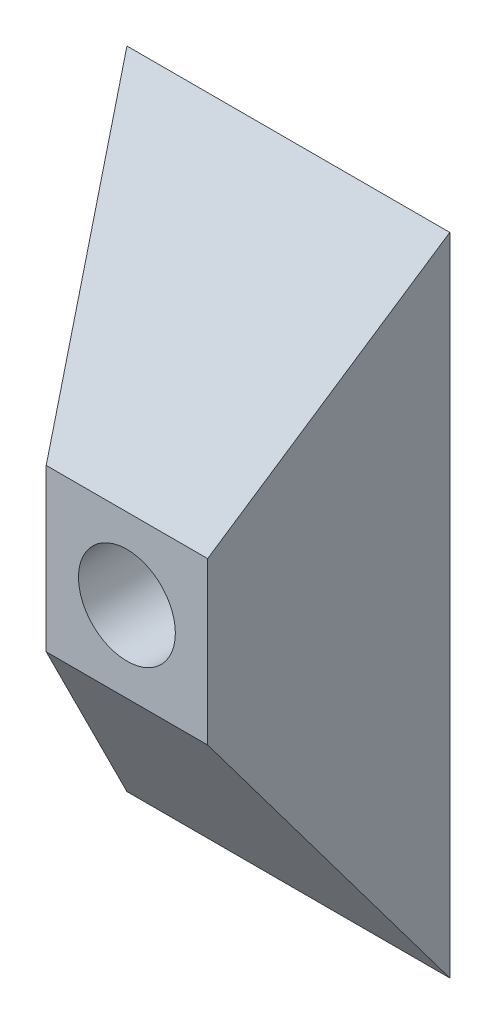
ISO-10303-21;
HEADER;
FILE_DESCRIPTION(('STEP AP214'),'2;1');
FILE_NAME('part.step','',(''),(''),'','','');
FILE_SCHEMA(('AUTOMOTIVE_DESIGN { 1 0 10303 214 1 1 1 1 }'));
ENDSEC;
DATA;
#1=APPLICATION_CONTEXT('core data for automotive mechanical design processes');
#2=APPLICATION_PROTOCOL_DEFINITION('international standard','automotive_design',2000,#1);
#3=PRODUCT_CONTEXT('',#1,'mechanical');
#4=PRODUCT('Part','Part','',(#3));
#5=PRODUCT_RELATED_PRODUCT_CATEGORY('part','',(#4));
#6=PRODUCT_DEFINITION_FORMATION('','',#4);
#7=PRODUCT_DEFINITION_CONTEXT('part definition',#1,'design');
#8=PRODUCT_DEFINITION('design','',#6,#7);
#9=PRODUCT_DEFINITION_SHAPE('','',#8);
#10=(LENGTH_UNIT() NAMED_UNIT(*) SI_UNIT(.MILLI.,.METRE.));
#11=(NAMED_UNIT(*) PLANE_ANGLE_UNIT() SI_UNIT($,.RADIAN.));
#12=(NAMED_UNIT(*) SI_UNIT($,.STERADIAN.) SOLID_ANGLE_UNIT());
#13=UNCERTAINTY_MEASURE_WITH_UNIT(LENGTH_MEASURE(1.E-05),#10,'distance_accuracy_value','');
#14=(GEOMETRIC_REPRESENTATION_CONTEXT(3) GLOBAL_UNCERTAINTY_ASSIGNED_CONTEXT((#13)) GLOBAL_UNIT_ASSIGNED_CONTEXT((#10,
#11,#12)) REPRESENTATION_CONTEXT('',''));
#15=CARTESIAN_POINT('',(0.,0.,0.));
#16=DIRECTION('',(0.,0.,1.));
#17=DIRECTION('',(1.,0.,0.));
#18=AXIS2_PLACEMENT_3D('',#15,#16,#17);
#19=CARTESIAN_POINT('',(0.,0.,0.));
#20=DIRECTION('',(0.,0.,1.));
#21=DIRECTION('',(1.,0.,0.));
#22=AXIS2_PLACEMENT_3D('',#19,#20,#21);
#23=CYLINDRICAL_SURFACE('',#22,1.5);
#24=CARTESIAN_POINT('',(0.,0.,5.));
#25=DIRECTION('',(0.,0.,1.));
#26=DIRECTION('',(1.,0.,0.));
#27=AXIS2_PLACEMENT_3D('',#24,#25,#26);
#28=CIRCLE('',#27,1.5);
#29=CARTESIAN_POINT('',(1.5,0.,5.));
#30=VERTEX_POINT('',#29);
#31=EDGE_CURVE('E235',#30,#30,#28,.T.);
#32=ORIENTED_EDGE('',*,*,#31,.T.);
#33=EDGE_LOOP('',(#32));
#34=FACE_BOUND('',#33,.T.);
#35=CARTESIAN_POINT('',(0.,0.,2.));
#36=DIRECTION('',(0.,0.,-1.));
#37=DIRECTION('',(-1.,0.,0.));
#38=AXIS2_PLACEMENT_3D('',#35,#36,#37);
#39=CIRCLE('',#38,1.5);
#40=CARTESIAN_POINT('',(-1.5,0.,2.));
#41=VERTEX_POINT('',#40);
#42=EDGE_CURVE('E49',#41,#41,#39,.F.);
#43=ORIENTED_EDGE('',*,*,#42,.F.);
#44=EDGE_LOOP('',(#43));
#45=FACE_BOUND('',#44,.T.);
#46=ADVANCED_FACE('F44',(#34,#45),#23,.F.);
#47=CARTESIAN_POINT('',(0.,0.,5.));
#48=DIRECTION('',(0.,0.,1.));
#49=DIRECTION('',(1.,0.,0.));
#50=AXIS2_PLACEMENT_3D('',#47,#48,#49);
#51=PLANE('',#50);
#52=ORIENTED_EDGE('',*,*,#31,.F.);
#53=EDGE_LOOP('',(#52));
#54=FACE_BOUND('',#53,.T.);
#55=DIRECTION('',(0.,1.,0.));
#56=VECTOR('',#55,1.);
#57=CARTESIAN_POINT('',(2.5,2.5,5.));
#58=LINE('',#57,#56);
#59=CARTESIAN_POINT('',(2.5,-2.5,5.));
#60=VERTEX_POINT('',#59);
#61=CARTESIAN_POINT('',(2.5,2.5,5.));
#62=VERTEX_POINT('',#61);
#63=EDGE_CURVE('E178',#60,#62,#58,.T.);
#64=ORIENTED_EDGE('',*,*,#63,.T.);
#65=DIRECTION('',(-1.,0.,0.));
#66=VECTOR('',#65,1.);
#67=CARTESIAN_POINT('',(-2.5,2.5,5.));
#68=LINE('',#67,#66);
#69=CARTESIAN_POINT('',(-2.5,2.5,5.));
#70=VERTEX_POINT('',#69);
#71=EDGE_CURVE('E80',#62,#70,#68,.T.);
#72=ORIENTED_EDGE('',*,*,#71,.T.);
#73=DIRECTION('',(0.,-1.,0.));
#74=VECTOR('',#73,1.);
#75=CARTESIAN_POINT('',(-2.5,2.5,5.));
#76=LINE('',#75,#74);
#77=CARTESIAN_POINT('',(-2.5,-2.5,5.));
#78=VERTEX_POINT('',#77);
#79=EDGE_CURVE('E155',#70,#78,#76,.T.);
#80=ORIENTED_EDGE('',*,*,#79,.T.);
#81=DIRECTION('',(1.,0.,0.));
#82=VECTOR('',#81,1.);
#83=CARTESIAN_POINT('',(-2.5,-2.5,5.));
#84=LINE('',#83,#82);
#85=EDGE_CURVE('E168',#78,#60,#84,.T.);
#86=ORIENTED_EDGE('',*,*,#85,.T.);
#87=EDGE_LOOP('',(#64,#72,#80,#86));
#88=FACE_BOUND('',#87,.T.);
#89=ADVANCED_FACE('F46',(#54,#88),#51,.T.);
#90=CARTESIAN_POINT('',(0.,0.,0.));
#91=DIRECTION('',(0.,0.,-1.));
#92=DIRECTION('',(-1.,0.,0.));
#93=AXIS2_PLACEMENT_3D('',#90,#91,#92);
#94=PLANE('',#93);
#95=CARTESIAN_POINT('',(0.,0.,0.));
#96=DIRECTION('',(0.,0.,-1.));
#97=DIRECTION('',(-1.,0.,0.));
#98=AXIS2_PLACEMENT_3D('',#95,#96,#97);
#99=CIRCLE('',#98,2.5);
#100=CARTESIAN_POINT('',(-2.5,0.,0.));
#101=VERTEX_POINT('',#100);
#102=EDGE_CURVE('E238',#101,#101,#99,.T.);
#103=ORIENTED_EDGE('',*,*,#102,.F.);
#104=EDGE_LOOP('',(#103));
#105=FACE_BOUND('',#104,.T.);
#106=DIRECTION('',(0.,1.,0.));
#107=VECTOR('',#106,1.);
#108=CARTESIAN_POINT('',(5.,-10.,0.));
#109=LINE('',#108,#107);
#110=CARTESIAN_POINT('',(5.,-10.,0.));
#111=VERTEX_POINT('',#110);
#112=CARTESIAN_POINT('',(5.,10.,0.));
#113=VERTEX_POINT('',#112);
#114=EDGE_CURVE('E98',#111,#113,#109,.T.);
#115=ORIENTED_EDGE('',*,*,#114,.F.);
#116=DIRECTION('',(1.,0.,0.));
#117=VECTOR('',#116,1.);
#118=CARTESIAN_POINT('',(-5.,-10.,0.));
#119=LINE('',#118,#117);
#120=CARTESIAN_POINT('',(-5.,-10.,0.));
#121=VERTEX_POINT('',#120);
#122=EDGE_CURVE('E12',#121,#111,#119,.T.);
#123=ORIENTED_EDGE('',*,*,#122,.F.);
#124=DIRECTION('',(0.,-1.,0.));
#125=VECTOR('',#124,1.);
#126=CARTESIAN_POINT('',(-5.,-10.,0.));
#127=LINE('',#126,#125);
#128=CARTESIAN_POINT('',(-5.,10.,0.));
#129=VERTEX_POINT('',#128);
#130=EDGE_CURVE('E55',#129,#121,#127,.T.);
#131=ORIENTED_EDGE('',*,*,#130,.F.);
#132=DIRECTION('',(-1.,0.,0.));
#133=VECTOR('',#132,1.);
#134=CARTESIAN_POINT('',(-5.,10.,0.));
#135=LINE('',#134,#133);
#136=EDGE_CURVE('E95',#113,#129,#135,.T.);
#137=ORIENTED_EDGE('',*,*,#136,.F.);
#138=EDGE_LOOP('',(#115,#123,#131,#137));
#139=FACE_BOUND('',#138,.T.);
#140=ADVANCED_FACE('F97',(#105,#139),#94,.T.);
#141=CARTESIAN_POINT('',(4.,0.,2.));
#142=DIRECTION('',(-0.894427190999916,0.,-0.447213595499958));
#143=DIRECTION('',(-0.447213595499958,0.,0.894427190999916));
#144=AXIS2_PLACEMENT_3D('',#141,#142,#143);
#145=PLANE('',#144);
#146=DIRECTION('',(-0.267261241912424,-0.801783725737273,0.534522483824849));
#147=VECTOR('',#146,1.);
#148=CARTESIAN_POINT('',(5.,10.,0.));
#149=LINE('',#148,#147);
#150=EDGE_CURVE('E86',#113,#62,#149,.T.);
#151=ORIENTED_EDGE('',*,*,#150,.T.);
#152=ORIENTED_EDGE('',*,*,#63,.F.);
#153=DIRECTION('',(-0.267261241912424,0.801783725737273,0.534522483824849));
#154=VECTOR('',#153,1.);
#155=CARTESIAN_POINT('',(5.,-10.,0.));
#156=LINE('',#155,#154);
#157=EDGE_CURVE('E64',#111,#60,#156,.T.);
#158=ORIENTED_EDGE('',*,*,#157,.F.);
#159=ORIENTED_EDGE('',*,*,#114,.T.);
#160=EDGE_LOOP('',(#151,#152,#158,#159));
#161=FACE_BOUND('',#160,.T.);
#162=ADVANCED_FACE('F108',(#161),#145,.F.);
#163=CARTESIAN_POINT('',(0.,-3.07692307692308,4.61538461538462));
#164=DIRECTION('',(0.,0.554700196225229,-0.832050294337844));
#165=DIRECTION('',(0.,0.832050294337844,0.554700196225229));
#166=AXIS2_PLACEMENT_3D('',#163,#164,#165);
#167=PLANE('',#166);
#168=ORIENTED_EDGE('',*,*,#157,.T.);
#169=ORIENTED_EDGE('',*,*,#85,.F.);
#170=DIRECTION('',(0.267261241912425,0.801783725737273,0.534522483824849));
#171=VECTOR('',#170,1.);
#172=CARTESIAN_POINT('',(-5.,-10.,0.));
#173=LINE('',#172,#171);
#174=EDGE_CURVE('E117',#121,#78,#173,.T.);
#175=ORIENTED_EDGE('',*,*,#174,.F.);
#176=ORIENTED_EDGE('',*,*,#122,.T.);
#177=EDGE_LOOP('',(#168,#169,#175,#176));
#178=FACE_BOUND('',#177,.T.);
#179=ADVANCED_FACE('F138',(#178),#167,.F.);
#180=CARTESIAN_POINT('',(0.,3.07692307692308,4.61538461538462));
#181=DIRECTION('',(0.,-0.554700196225229,-0.832050294337844));
#182=DIRECTION('',(0.,0.832050294337844,-0.554700196225229));
#183=AXIS2_PLACEMENT_3D('',#180,#181,#182);
#184=PLANE('',#183);
#185=DIRECTION('',(0.267261241912425,-0.801783725737273,0.534522483824849));
#186=VECTOR('',#185,1.);
#187=CARTESIAN_POINT('',(-5.,10.,0.));
#188=LINE('',#187,#186);
#189=EDGE_CURVE('E114',#129,#70,#188,.T.);
#190=ORIENTED_EDGE('',*,*,#189,.T.);
#191=ORIENTED_EDGE('',*,*,#71,.F.);
#192=ORIENTED_EDGE('',*,*,#150,.F.);
#193=ORIENTED_EDGE('',*,*,#136,.T.);
#194=EDGE_LOOP('',(#190,#191,#192,#193));
#195=FACE_BOUND('',#194,.T.);
#196=ADVANCED_FACE('F112',(#195),#184,.F.);
#197=CARTESIAN_POINT('',(-4.,0.,2.));
#198=DIRECTION('',(0.894427190999916,0.,-0.447213595499958));
#199=DIRECTION('',(-0.447213595499958,0.,-0.894427190999916));
#200=AXIS2_PLACEMENT_3D('',#197,#198,#199);
#201=PLANE('',#200);
#202=ORIENTED_EDGE('',*,*,#174,.T.);
#203=ORIENTED_EDGE('',*,*,#79,.F.);
#204=ORIENTED_EDGE('',*,*,#189,.F.);
#205=ORIENTED_EDGE('',*,*,#130,.T.);
#206=EDGE_LOOP('',(#202,#203,#204,#205));
#207=FACE_BOUND('',#206,.T.);
#208=ADVANCED_FACE('F137',(#207),#201,.F.);
#209=CARTESIAN_POINT('',(0.,0.,2.));
#210=DIRECTION('',(0.,0.,-1.));
#211=DIRECTION('',(-1.,0.,0.));
#212=AXIS2_PLACEMENT_3D('',#209,#210,#211);
#213=PLANE('',#212);
#214=CARTESIAN_POINT('',(0.,0.,2.));
#215=DIRECTION('',(0.,0.,-1.));
#216=DIRECTION('',(-1.,0.,0.));
#217=AXIS2_PLACEMENT_3D('',#214,#215,#216);
#218=CIRCLE('',#217,2.5);
#219=CARTESIAN_POINT('',(-2.5,0.,2.));
#220=VERTEX_POINT('',#219);
#221=EDGE_CURVE('E241',#220,#220,#218,.T.);
#222=ORIENTED_EDGE('',*,*,#221,.T.);
#223=EDGE_LOOP('',(#222));
#224=FACE_BOUND('',#223,.T.);
#225=ORIENTED_EDGE('',*,*,#42,.T.);
#226=EDGE_LOOP('',(#225));
#227=FACE_BOUND('',#226,.T.);
#228=ADVANCED_FACE('F248',(#224,#227),#213,.T.);
#229=CARTESIAN_POINT('',(0.,0.,2.));
#230=DIRECTION('',(0.,0.,-1.));
#231=DIRECTION('',(-1.,0.,0.));
#232=AXIS2_PLACEMENT_3D('',#229,#230,#231);
#233=CYLINDRICAL_SURFACE('',#232,2.5);
#234=ORIENTED_EDGE('',*,*,#221,.F.);
#235=EDGE_LOOP('',(#234));
#236=FACE_BOUND('',#235,.T.);
#237=ORIENTED_EDGE('',*,*,#102,.T.);
#238=EDGE_LOOP('',(#237));
#239=FACE_BOUND('',#238,.T.);
#240=ADVANCED_FACE('F339',(#236,#239),#233,.F.);
#241=CLOSED_SHELL('',(#46,#89,#140,#162,#179,#196,#208,#228,#240));
#242=MANIFOLD_SOLID_BREP('B2',#241);
#243=ADVANCED_BREP_SHAPE_REPRESENTATION('',(#18,#242),#14);
#244=SHAPE_DEFINITION_REPRESENTATION(#9,#243);
ENDSEC;
END-ISO-10303-21;
